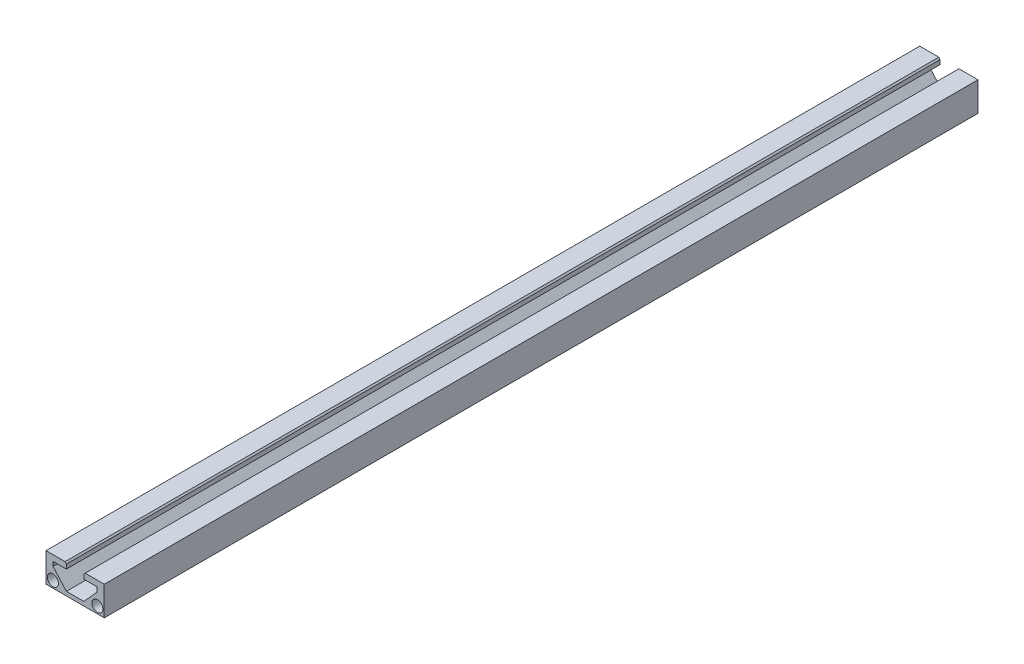
ISO-10303-21;
HEADER;
FILE_DESCRIPTION(('STEP AP214'),'2;1');
FILE_NAME('part.step','',(''),(''),'','','');
FILE_SCHEMA(('AUTOMOTIVE_DESIGN { 1 0 10303 214 1 1 1 1 }'));
ENDSEC;
DATA;
#1=APPLICATION_CONTEXT('core data for automotive mechanical design processes');
#2=APPLICATION_PROTOCOL_DEFINITION('international standard','automotive_design',2000,#1);
#3=PRODUCT_CONTEXT('',#1,'mechanical');
#4=PRODUCT('Part','Part','',(#3));
#5=PRODUCT_RELATED_PRODUCT_CATEGORY('part','',(#4));
#6=PRODUCT_DEFINITION_FORMATION('','',#4);
#7=PRODUCT_DEFINITION_CONTEXT('part definition',#1,'design');
#8=PRODUCT_DEFINITION('design','',#6,#7);
#9=PRODUCT_DEFINITION_SHAPE('','',#8);
#10=(LENGTH_UNIT() NAMED_UNIT(*) SI_UNIT(.MILLI.,.METRE.));
#11=(NAMED_UNIT(*) PLANE_ANGLE_UNIT() SI_UNIT($,.RADIAN.));
#12=(NAMED_UNIT(*) SI_UNIT($,.STERADIAN.) SOLID_ANGLE_UNIT());
#13=UNCERTAINTY_MEASURE_WITH_UNIT(LENGTH_MEASURE(1.E-05),#10,'distance_accuracy_value','');
#14=(GEOMETRIC_REPRESENTATION_CONTEXT(3) GLOBAL_UNCERTAINTY_ASSIGNED_CONTEXT((#13)) GLOBAL_UNIT_ASSIGNED_CONTEXT((#10,
#11,#12)) REPRESENTATION_CONTEXT('',''));
#15=CARTESIAN_POINT('',(0.,0.,0.));
#16=DIRECTION('',(0.,0.,1.));
#17=DIRECTION('',(1.,0.,0.));
#18=AXIS2_PLACEMENT_3D('',#15,#16,#17);
#19=CARTESIAN_POINT('',(3.,0.,150.));
#20=DIRECTION('',(0.,-1.,0.));
#21=DIRECTION('',(1.,0.,0.));
#22=AXIS2_PLACEMENT_3D('',#19,#20,#21);
#23=PLANE('',#22);
#24=CARTESIAN_POINT('',(0.,0.,-140.));
#25=DIRECTION('',(0.,-1.,0.));
#26=DIRECTION('',(-1.,0.,0.));
#27=AXIS2_PLACEMENT_3D('',#24,#25,#26);
#28=CIRCLE('',#27,2.);
#29=CARTESIAN_POINT('',(-2.,0.,-140.));
#30=VERTEX_POINT('',#29);
#31=EDGE_CURVE('E208',#30,#30,#28,.T.);
#32=ORIENTED_EDGE('',*,*,#31,.T.);
#33=EDGE_LOOP('',(#32));
#34=FACE_BOUND('',#33,.T.);
#35=CARTESIAN_POINT('',(0.,0.,140.));
#36=DIRECTION('',(0.,1.,0.));
#37=DIRECTION('',(-1.,0.,0.));
#38=AXIS2_PLACEMENT_3D('',#35,#36,#37);
#39=CIRCLE('',#38,2.);
#40=CARTESIAN_POINT('',(-2.,0.,140.));
#41=VERTEX_POINT('',#40);
#42=EDGE_CURVE('E194',#41,#41,#39,.T.);
#43=ORIENTED_EDGE('',*,*,#42,.F.);
#44=EDGE_LOOP('',(#43));
#45=FACE_BOUND('',#44,.T.);
#46=DIRECTION('',(-1.,0.,0.));
#47=VECTOR('',#46,1.);
#48=CARTESIAN_POINT('',(3.,0.,-150.));
#49=LINE('',#48,#47);
#50=CARTESIAN_POINT('',(3.,0.,-150.));
#51=VERTEX_POINT('',#50);
#52=CARTESIAN_POINT('',(-3.,0.,-150.));
#53=VERTEX_POINT('',#52);
#54=EDGE_CURVE('E147',#51,#53,#49,.T.);
#55=ORIENTED_EDGE('',*,*,#54,.T.);
#56=DIRECTION('',(0.,0.,-1.));
#57=VECTOR('',#56,1.);
#58=CARTESIAN_POINT('',(-3.,0.,150.));
#59=LINE('',#58,#57);
#60=CARTESIAN_POINT('',(-3.,0.,150.));
#61=VERTEX_POINT('',#60);
#62=EDGE_CURVE('E152',#61,#53,#59,.T.);
#63=ORIENTED_EDGE('',*,*,#62,.F.);
#64=DIRECTION('',(-1.,0.,0.));
#65=VECTOR('',#64,1.);
#66=CARTESIAN_POINT('',(3.,0.,150.));
#67=LINE('',#66,#65);
#68=CARTESIAN_POINT('',(3.,0.,150.));
#69=VERTEX_POINT('',#68);
#70=EDGE_CURVE('E173',#69,#61,#67,.T.);
#71=ORIENTED_EDGE('',*,*,#70,.F.);
#72=DIRECTION('',(0.,0.,-1.));
#73=VECTOR('',#72,1.);
#74=CARTESIAN_POINT('',(3.,0.,150.));
#75=LINE('',#74,#73);
#76=EDGE_CURVE('E143',#69,#51,#75,.T.);
#77=ORIENTED_EDGE('',*,*,#76,.T.);
#78=EDGE_LOOP('',(#55,#63,#71,#77));
#79=FACE_BOUND('',#78,.T.);
#80=ADVANCED_FACE('F39',(#34,#45,#79),#23,.F.);
#81=CARTESIAN_POINT('',(0.,-1.38297872340426,150.));
#82=DIRECTION('',(0.,1.,0.));
#83=DIRECTION('',(0.,0.,1.));
#84=AXIS2_PLACEMENT_3D('',#81,#82,#83);
#85=PLANE('',#84);
#86=CARTESIAN_POINT('',(0.,-1.38297872340426,-140.));
#87=DIRECTION('',(0.,1.,0.));
#88=DIRECTION('',(0.,0.,1.));
#89=AXIS2_PLACEMENT_3D('',#86,#87,#88);
#90=CIRCLE('',#89,2.);
#91=CARTESIAN_POINT('',(0.,-1.38297872340426,-138.));
#92=VERTEX_POINT('',#91);
#93=EDGE_CURVE('E42',#92,#92,#90,.F.);
#94=ORIENTED_EDGE('',*,*,#93,.F.);
#95=EDGE_LOOP('',(#94));
#96=FACE_BOUND('',#95,.T.);
#97=CARTESIAN_POINT('',(0.,-1.38297872340426,140.));
#98=DIRECTION('',(0.,1.,0.));
#99=DIRECTION('',(0.,0.,1.));
#100=AXIS2_PLACEMENT_3D('',#97,#98,#99);
#101=CIRCLE('',#100,2.);
#102=CARTESIAN_POINT('',(0.,-1.38297872340426,142.));
#103=VERTEX_POINT('',#102);
#104=EDGE_CURVE('E190',#103,#103,#101,.T.);
#105=ORIENTED_EDGE('',*,*,#104,.T.);
#106=EDGE_LOOP('',(#105));
#107=FACE_BOUND('',#106,.T.);
#108=DIRECTION('',(1.,0.,0.));
#109=VECTOR('',#108,1.);
#110=CARTESIAN_POINT('',(0.,-1.38297872340426,-150.));
#111=LINE('',#110,#109);
#112=CARTESIAN_POINT('',(-10.,-1.38297872340426,-150.));
#113=VERTEX_POINT('',#112);
#114=CARTESIAN_POINT('',(10.,-1.38297872340426,-150.));
#115=VERTEX_POINT('',#114);
#116=EDGE_CURVE('E151',#113,#115,#111,.T.);
#117=ORIENTED_EDGE('',*,*,#116,.T.);
#118=DIRECTION('',(0.,0.,-1.));
#119=VECTOR('',#118,1.);
#120=CARTESIAN_POINT('',(10.,-1.38297872340426,150.));
#121=LINE('',#120,#119);
#122=CARTESIAN_POINT('',(10.,-1.38297872340426,150.));
#123=VERTEX_POINT('',#122);
#124=EDGE_CURVE('E11',#123,#115,#121,.T.);
#125=ORIENTED_EDGE('',*,*,#124,.F.);
#126=DIRECTION('',(1.,0.,0.));
#127=VECTOR('',#126,1.);
#128=CARTESIAN_POINT('',(0.,-1.38297872340426,150.));
#129=LINE('',#128,#127);
#130=CARTESIAN_POINT('',(-10.,-1.38297872340426,150.));
#131=VERTEX_POINT('',#130);
#132=EDGE_CURVE('E102',#131,#123,#129,.T.);
#133=ORIENTED_EDGE('',*,*,#132,.F.);
#134=DIRECTION('',(0.,0.,-1.));
#135=VECTOR('',#134,1.);
#136=CARTESIAN_POINT('',(-10.,-1.38297872340426,150.));
#137=LINE('',#136,#135);
#138=EDGE_CURVE('E252',#131,#113,#137,.T.);
#139=ORIENTED_EDGE('',*,*,#138,.T.);
#140=EDGE_LOOP('',(#117,#125,#133,#139));
#141=FACE_BOUND('',#140,.T.);
#142=ADVANCED_FACE('F382',(#96,#107,#141),#85,.F.);
#143=CARTESIAN_POINT('',(10.,-1.38297872340426,150.));
#144=DIRECTION('',(-1.,0.,0.));
#145=DIRECTION('',(0.,0.,1.));
#146=AXIS2_PLACEMENT_3D('',#143,#144,#145);
#147=PLANE('',#146);
#148=DIRECTION('',(0.,1.,0.));
#149=VECTOR('',#148,1.);
#150=CARTESIAN_POINT('',(10.,-1.38297872340426,-150.));
#151=LINE('',#150,#149);
#152=CARTESIAN_POINT('',(10.,8.61702127659574,-150.));
#153=VERTEX_POINT('',#152);
#154=EDGE_CURVE('E155',#115,#153,#151,.T.);
#155=ORIENTED_EDGE('',*,*,#154,.T.);
#156=DIRECTION('',(0.,0.,-1.));
#157=VECTOR('',#156,1.);
#158=CARTESIAN_POINT('',(10.,8.61702127659574,150.));
#159=LINE('',#158,#157);
#160=CARTESIAN_POINT('',(10.,8.61702127659574,150.));
#161=VERTEX_POINT('',#160);
#162=EDGE_CURVE('E49',#161,#153,#159,.T.);
#163=ORIENTED_EDGE('',*,*,#162,.F.);
#164=DIRECTION('',(0.,1.,0.));
#165=VECTOR('',#164,1.);
#166=CARTESIAN_POINT('',(10.,-1.38297872340426,150.));
#167=LINE('',#166,#165);
#168=EDGE_CURVE('E313',#123,#161,#167,.T.);
#169=ORIENTED_EDGE('',*,*,#168,.F.);
#170=ORIENTED_EDGE('',*,*,#124,.T.);
#171=EDGE_LOOP('',(#155,#163,#169,#170));
#172=FACE_BOUND('',#171,.T.);
#173=ADVANCED_FACE('F403',(#172),#147,.F.);
#174=CARTESIAN_POINT('',(10.,8.61702127659574,150.));
#175=DIRECTION('',(0.,-1.,0.));
#176=DIRECTION('',(1.,0.,0.));
#177=AXIS2_PLACEMENT_3D('',#174,#175,#176);
#178=PLANE('',#177);
#179=DIRECTION('',(-1.,0.,0.));
#180=VECTOR('',#179,1.);
#181=CARTESIAN_POINT('',(10.,8.61702127659574,-150.));
#182=LINE('',#181,#180);
#183=CARTESIAN_POINT('',(3.44821174677154,8.61702127659574,-150.));
#184=VERTEX_POINT('',#183);
#185=EDGE_CURVE('E158',#153,#184,#182,.T.);
#186=ORIENTED_EDGE('',*,*,#185,.T.);
#187=DIRECTION('',(0.,0.,-1.));
#188=VECTOR('',#187,1.);
#189=CARTESIAN_POINT('',(3.44821174677154,8.61702127659574,150.));
#190=LINE('',#189,#188);
#191=CARTESIAN_POINT('',(3.44821174677154,8.61702127659574,150.));
#192=VERTEX_POINT('',#191);
#193=EDGE_CURVE('E184',#192,#184,#190,.T.);
#194=ORIENTED_EDGE('',*,*,#193,.F.);
#195=DIRECTION('',(-1.,0.,0.));
#196=VECTOR('',#195,1.);
#197=CARTESIAN_POINT('',(10.,8.61702127659574,150.));
#198=LINE('',#197,#196);
#199=EDGE_CURVE('E316',#161,#192,#198,.T.);
#200=ORIENTED_EDGE('',*,*,#199,.F.);
#201=ORIENTED_EDGE('',*,*,#162,.T.);
#202=EDGE_LOOP('',(#186,#194,#200,#201));
#203=FACE_BOUND('',#202,.T.);
#204=ADVANCED_FACE('F453',(#203),#178,.F.);
#205=CARTESIAN_POINT('',(3.44821174677154,8.61702127659574,150.));
#206=DIRECTION('',(0.744616896860696,-0.667492080035073,0.));
#207=DIRECTION('',(0.667492080035073,0.744616896860696,0.));
#208=AXIS2_PLACEMENT_3D('',#205,#206,#207);
#209=PLANE('',#208);
#210=DIRECTION('',(-0.667492080035073,-0.744616896860696,0.));
#211=VECTOR('',#210,1.);
#212=CARTESIAN_POINT('',(3.44821174677154,8.61702127659574,-150.));
#213=LINE('',#212,#211);
#214=CARTESIAN_POINT('',(3.,8.11702127659574,-150.));
#215=VERTEX_POINT('',#214);
#216=EDGE_CURVE('E161',#184,#215,#213,.T.);
#217=ORIENTED_EDGE('',*,*,#216,.T.);
#218=DIRECTION('',(0.,0.,-1.));
#219=VECTOR('',#218,1.);
#220=CARTESIAN_POINT('',(3.,8.11702127659574,150.));
#221=LINE('',#220,#219);
#222=CARTESIAN_POINT('',(3.,8.11702127659574,150.));
#223=VERTEX_POINT('',#222);
#224=EDGE_CURVE('E180',#223,#215,#221,.T.);
#225=ORIENTED_EDGE('',*,*,#224,.F.);
#226=DIRECTION('',(-0.667492080035073,-0.744616896860696,0.));
#227=VECTOR('',#226,1.);
#228=CARTESIAN_POINT('',(3.44821174677154,8.61702127659574,150.));
#229=LINE('',#228,#227);
#230=EDGE_CURVE('E319',#192,#223,#229,.T.);
#231=ORIENTED_EDGE('',*,*,#230,.F.);
#232=ORIENTED_EDGE('',*,*,#193,.T.);
#233=EDGE_LOOP('',(#217,#225,#231,#232));
#234=FACE_BOUND('',#233,.T.);
#235=ADVANCED_FACE('F327',(#234),#209,.F.);
#236=CARTESIAN_POINT('',(3.,8.11702127659574,150.));
#237=DIRECTION('',(1.,0.,0.));
#238=DIRECTION('',(0.,0.,-1.));
#239=AXIS2_PLACEMENT_3D('',#236,#237,#238);
#240=PLANE('',#239);
#241=DIRECTION('',(0.,-1.,0.));
#242=VECTOR('',#241,1.);
#243=CARTESIAN_POINT('',(3.,8.11702127659574,-150.));
#244=LINE('',#243,#242);
#245=CARTESIAN_POINT('',(3.,6.61702127659574,-150.));
#246=VERTEX_POINT('',#245);
#247=EDGE_CURVE('E164',#215,#246,#244,.T.);
#248=ORIENTED_EDGE('',*,*,#247,.T.);
#249=DIRECTION('',(0.,0.,-1.));
#250=VECTOR('',#249,1.);
#251=CARTESIAN_POINT('',(3.,6.61702127659574,150.));
#252=LINE('',#251,#250);
#253=CARTESIAN_POINT('',(3.,6.61702127659574,150.));
#254=VERTEX_POINT('',#253);
#255=EDGE_CURVE('E136',#254,#246,#252,.T.);
#256=ORIENTED_EDGE('',*,*,#255,.F.);
#257=DIRECTION('',(0.,-1.,0.));
#258=VECTOR('',#257,1.);
#259=CARTESIAN_POINT('',(3.,8.11702127659574,150.));
#260=LINE('',#259,#258);
#261=EDGE_CURVE('E125',#223,#254,#260,.T.);
#262=ORIENTED_EDGE('',*,*,#261,.F.);
#263=ORIENTED_EDGE('',*,*,#224,.T.);
#264=EDGE_LOOP('',(#248,#256,#262,#263));
#265=FACE_BOUND('',#264,.T.);
#266=ADVANCED_FACE('F331',(#265),#240,.F.);
#267=CARTESIAN_POINT('',(3.,6.61702127659574,150.));
#268=DIRECTION('',(0.,1.,0.));
#269=DIRECTION('',(0.,0.,1.));
#270=AXIS2_PLACEMENT_3D('',#267,#268,#269);
#271=PLANE('',#270);
#272=DIRECTION('',(1.,0.,0.));
#273=VECTOR('',#272,1.);
#274=CARTESIAN_POINT('',(3.,6.61702127659574,-150.));
#275=LINE('',#274,#273);
#276=CARTESIAN_POINT('',(7.58701808930022,6.61702127659574,-150.));
#277=VERTEX_POINT('',#276);
#278=EDGE_CURVE('E134',#246,#277,#275,.T.);
#279=ORIENTED_EDGE('',*,*,#278,.T.);
#280=DIRECTION('',(0.,0.,-1.));
#281=VECTOR('',#280,1.);
#282=CARTESIAN_POINT('',(7.58701808930022,6.61702127659574,150.));
#283=LINE('',#282,#281);
#284=CARTESIAN_POINT('',(7.58701808930022,6.61702127659574,150.));
#285=VERTEX_POINT('',#284);
#286=EDGE_CURVE('E131',#285,#277,#283,.T.);
#287=ORIENTED_EDGE('',*,*,#286,.F.);
#288=DIRECTION('',(1.,0.,0.));
#289=VECTOR('',#288,1.);
#290=CARTESIAN_POINT('',(3.,6.61702127659574,150.));
#291=LINE('',#290,#289);
#292=EDGE_CURVE('E119',#254,#285,#291,.T.);
#293=ORIENTED_EDGE('',*,*,#292,.F.);
#294=ORIENTED_EDGE('',*,*,#255,.T.);
#295=EDGE_LOOP('',(#279,#287,#293,#294));
#296=FACE_BOUND('',#295,.T.);
#297=ADVANCED_FACE('F132',(#296),#271,.F.);
#298=CARTESIAN_POINT('',(7.58701808930022,6.61702127659574,150.));
#299=DIRECTION('',(1.,0.,0.));
#300=DIRECTION('',(0.,1.,0.));
#301=AXIS2_PLACEMENT_3D('',#298,#299,#300);
#302=PLANE('',#301);
#303=DIRECTION('',(0.,-1.,0.));
#304=VECTOR('',#303,1.);
#305=CARTESIAN_POINT('',(7.58701808930022,6.61702127659574,-150.));
#306=LINE('',#305,#304);
#307=CARTESIAN_POINT('',(7.58701808930022,5.11702127659574,-150.));
#308=VERTEX_POINT('',#307);
#309=EDGE_CURVE('E88',#277,#308,#306,.T.);
#310=ORIENTED_EDGE('',*,*,#309,.T.);
#311=DIRECTION('',(0.,0.,-1.));
#312=VECTOR('',#311,1.);
#313=CARTESIAN_POINT('',(7.58701808930022,5.11702127659574,150.));
#314=LINE('',#313,#312);
#315=CARTESIAN_POINT('',(7.58701808930022,5.11702127659574,150.));
#316=VERTEX_POINT('',#315);
#317=EDGE_CURVE('E137',#316,#308,#314,.T.);
#318=ORIENTED_EDGE('',*,*,#317,.F.);
#319=DIRECTION('',(0.,-1.,0.));
#320=VECTOR('',#319,1.);
#321=CARTESIAN_POINT('',(7.58701808930022,6.61702127659574,150.));
#322=LINE('',#321,#320);
#323=EDGE_CURVE('E123',#285,#316,#322,.T.);
#324=ORIENTED_EDGE('',*,*,#323,.F.);
#325=ORIENTED_EDGE('',*,*,#286,.T.);
#326=EDGE_LOOP('',(#310,#318,#324,#325));
#327=FACE_BOUND('',#326,.T.);
#328=ADVANCED_FACE('F139',(#327),#302,.F.);
#329=CARTESIAN_POINT('',(7.58701808930022,5.11702127659574,150.));
#330=DIRECTION('',(0.744616896860696,-0.667492080035072,0.));
#331=DIRECTION('',(0.667492080035072,0.744616896860696,0.));
#332=AXIS2_PLACEMENT_3D('',#329,#330,#331);
#333=PLANE('',#332);
#334=DIRECTION('',(-0.667492080035072,-0.744616896860696,0.));
#335=VECTOR('',#334,1.);
#336=CARTESIAN_POINT('',(7.58701808930022,5.11702127659574,-150.));
#337=LINE('',#336,#335);
#338=EDGE_CURVE('E94',#308,#51,#337,.T.);
#339=ORIENTED_EDGE('',*,*,#338,.T.);
#340=ORIENTED_EDGE('',*,*,#76,.F.);
#341=DIRECTION('',(-0.667492080035072,-0.744616896860696,0.));
#342=VECTOR('',#341,1.);
#343=CARTESIAN_POINT('',(7.58701808930022,5.11702127659574,150.));
#344=LINE('',#343,#342);
#345=EDGE_CURVE('E58',#316,#69,#344,.T.);
#346=ORIENTED_EDGE('',*,*,#345,.F.);
#347=ORIENTED_EDGE('',*,*,#317,.T.);
#348=EDGE_LOOP('',(#339,#340,#346,#347));
#349=FACE_BOUND('',#348,.T.);
#350=ADVANCED_FACE('F431',(#349),#333,.F.);
#351=CARTESIAN_POINT('',(0.,0.,150.));
#352=DIRECTION('',(0.,0.,1.));
#353=DIRECTION('',(1.,0.,0.));
#354=AXIS2_PLACEMENT_3D('',#351,#352,#353);
#355=PLANE('',#354);
#356=CARTESIAN_POINT('',(-7.64671625703689,0.970305019558831,150.));
#357=DIRECTION('',(0.,0.,-1.));
#358=DIRECTION('',(-1.,0.,0.));
#359=AXIS2_PLACEMENT_3D('',#356,#357,#358);
#360=CIRCLE('',#359,1.9);
#361=CARTESIAN_POINT('',(-9.54671625703689,0.970305019558831,150.));
#362=VERTEX_POINT('',#361);
#363=EDGE_CURVE('E193',#362,#362,#360,.T.);
#364=ORIENTED_EDGE('',*,*,#363,.T.);
#365=EDGE_LOOP('',(#364));
#366=FACE_BOUND('',#365,.T.);
#367=CARTESIAN_POINT('',(7.64671625703689,0.970305019558831,150.));
#368=DIRECTION('',(0.,0.,1.));
#369=DIRECTION('',(1.,0.,0.));
#370=AXIS2_PLACEMENT_3D('',#367,#368,#369);
#371=CIRCLE('',#370,1.9);
#372=CARTESIAN_POINT('',(9.54671625703689,0.970305019558831,150.));
#373=VERTEX_POINT('',#372);
#374=EDGE_CURVE('E213',#373,#373,#371,.T.);
#375=ORIENTED_EDGE('',*,*,#374,.F.);
#376=EDGE_LOOP('',(#375));
#377=FACE_BOUND('',#376,.T.);
#378=ORIENTED_EDGE('',*,*,#70,.T.);
#379=DIRECTION('',(0.667492080035072,-0.744616896860696,0.));
#380=VECTOR('',#379,1.);
#381=CARTESIAN_POINT('',(-7.58701808930022,5.11702127659574,150.));
#382=LINE('',#381,#380);
#383=CARTESIAN_POINT('',(-7.58701808930022,5.11702127659574,150.));
#384=VERTEX_POINT('',#383);
#385=EDGE_CURVE('E223',#384,#61,#382,.T.);
#386=ORIENTED_EDGE('',*,*,#385,.F.);
#387=DIRECTION('',(0.,-1.,0.));
#388=VECTOR('',#387,1.);
#389=CARTESIAN_POINT('',(-7.58701808930022,6.61702127659574,150.));
#390=LINE('',#389,#388);
#391=CARTESIAN_POINT('',(-7.58701808930022,6.61702127659574,150.));
#392=VERTEX_POINT('',#391);
#393=EDGE_CURVE('E227',#392,#384,#390,.T.);
#394=ORIENTED_EDGE('',*,*,#393,.F.);
#395=DIRECTION('',(-1.,0.,0.));
#396=VECTOR('',#395,1.);
#397=CARTESIAN_POINT('',(-3.,6.61702127659574,150.));
#398=LINE('',#397,#396);
#399=CARTESIAN_POINT('',(-3.,6.61702127659574,150.));
#400=VERTEX_POINT('',#399);
#401=EDGE_CURVE('E232',#400,#392,#398,.T.);
#402=ORIENTED_EDGE('',*,*,#401,.F.);
#403=DIRECTION('',(0.,-1.,0.));
#404=VECTOR('',#403,1.);
#405=CARTESIAN_POINT('',(-3.,8.11702127659574,150.));
#406=LINE('',#405,#404);
#407=CARTESIAN_POINT('',(-3.,8.11702127659574,150.));
#408=VERTEX_POINT('',#407);
#409=EDGE_CURVE('E236',#408,#400,#406,.T.);
#410=ORIENTED_EDGE('',*,*,#409,.F.);
#411=DIRECTION('',(0.667492080035073,-0.744616896860696,0.));
#412=VECTOR('',#411,1.);
#413=CARTESIAN_POINT('',(-3.44821174677154,8.61702127659574,150.));
#414=LINE('',#413,#412);
#415=CARTESIAN_POINT('',(-3.44821174677154,8.61702127659574,150.));
#416=VERTEX_POINT('',#415);
#417=EDGE_CURVE('E240',#416,#408,#414,.T.);
#418=ORIENTED_EDGE('',*,*,#417,.F.);
#419=DIRECTION('',(1.,0.,0.));
#420=VECTOR('',#419,1.);
#421=CARTESIAN_POINT('',(-10.,8.61702127659574,150.));
#422=LINE('',#421,#420);
#423=CARTESIAN_POINT('',(-10.,8.61702127659574,150.));
#424=VERTEX_POINT('',#423);
#425=EDGE_CURVE('E244',#424,#416,#422,.T.);
#426=ORIENTED_EDGE('',*,*,#425,.F.);
#427=DIRECTION('',(0.,1.,0.));
#428=VECTOR('',#427,1.);
#429=CARTESIAN_POINT('',(-10.,-1.38297872340426,150.));
#430=LINE('',#429,#428);
#431=EDGE_CURVE('E248',#131,#424,#430,.T.);
#432=ORIENTED_EDGE('',*,*,#431,.F.);
#433=ORIENTED_EDGE('',*,*,#132,.T.);
#434=ORIENTED_EDGE('',*,*,#168,.T.);
#435=ORIENTED_EDGE('',*,*,#199,.T.);
#436=ORIENTED_EDGE('',*,*,#230,.T.);
#437=ORIENTED_EDGE('',*,*,#261,.T.);
#438=ORIENTED_EDGE('',*,*,#292,.T.);
#439=ORIENTED_EDGE('',*,*,#323,.T.);
#440=ORIENTED_EDGE('',*,*,#345,.T.);
#441=EDGE_LOOP('',(#378,#386,#394,#402,#410,#418,#426,#432,#433,#434,#435,#436,#437,#438,#439,#440));
#442=FACE_BOUND('',#441,.T.);
#443=ADVANCED_FACE('F121',(#366,#377,#442),#355,.T.);
#444=CARTESIAN_POINT('',(0.,0.,-150.));
#445=DIRECTION('',(0.,0.,1.));
#446=DIRECTION('',(1.,0.,0.));
#447=AXIS2_PLACEMENT_3D('',#444,#445,#446);
#448=PLANE('',#447);
#449=CARTESIAN_POINT('',(-7.64671625703689,0.970305019558831,-150.));
#450=DIRECTION('',(0.,0.,-1.));
#451=DIRECTION('',(-1.,0.,0.));
#452=AXIS2_PLACEMENT_3D('',#449,#450,#451);
#453=CIRCLE('',#452,1.9);
#454=CARTESIAN_POINT('',(-9.54671625703689,0.970305019558831,-150.));
#455=VERTEX_POINT('',#454);
#456=EDGE_CURVE('E200',#455,#455,#453,.T.);
#457=ORIENTED_EDGE('',*,*,#456,.F.);
#458=EDGE_LOOP('',(#457));
#459=FACE_BOUND('',#458,.T.);
#460=CARTESIAN_POINT('',(7.64671625703689,0.970305019558831,-150.));
#461=DIRECTION('',(0.,0.,1.));
#462=DIRECTION('',(1.,0.,0.));
#463=AXIS2_PLACEMENT_3D('',#460,#461,#462);
#464=CIRCLE('',#463,1.9);
#465=CARTESIAN_POINT('',(9.54671625703689,0.970305019558831,-150.));
#466=VERTEX_POINT('',#465);
#467=EDGE_CURVE('E215',#466,#466,#464,.T.);
#468=ORIENTED_EDGE('',*,*,#467,.T.);
#469=EDGE_LOOP('',(#468));
#470=FACE_BOUND('',#469,.T.);
#471=ORIENTED_EDGE('',*,*,#54,.F.);
#472=ORIENTED_EDGE('',*,*,#338,.F.);
#473=ORIENTED_EDGE('',*,*,#309,.F.);
#474=ORIENTED_EDGE('',*,*,#278,.F.);
#475=ORIENTED_EDGE('',*,*,#247,.F.);
#476=ORIENTED_EDGE('',*,*,#216,.F.);
#477=ORIENTED_EDGE('',*,*,#185,.F.);
#478=ORIENTED_EDGE('',*,*,#154,.F.);
#479=ORIENTED_EDGE('',*,*,#116,.F.);
#480=DIRECTION('',(0.,1.,0.));
#481=VECTOR('',#480,1.);
#482=CARTESIAN_POINT('',(-10.,-1.38297872340426,-150.));
#483=LINE('',#482,#481);
#484=CARTESIAN_POINT('',(-10.,8.61702127659574,-150.));
#485=VERTEX_POINT('',#484);
#486=EDGE_CURVE('E228',#113,#485,#483,.T.);
#487=ORIENTED_EDGE('',*,*,#486,.T.);
#488=DIRECTION('',(1.,0.,0.));
#489=VECTOR('',#488,1.);
#490=CARTESIAN_POINT('',(-10.,8.61702127659574,-150.));
#491=LINE('',#490,#489);
#492=CARTESIAN_POINT('',(-3.44821174677154,8.61702127659574,-150.));
#493=VERTEX_POINT('',#492);
#494=EDGE_CURVE('E272',#485,#493,#491,.T.);
#495=ORIENTED_EDGE('',*,*,#494,.T.);
#496=DIRECTION('',(0.667492080035073,-0.744616896860696,0.));
#497=VECTOR('',#496,1.);
#498=CARTESIAN_POINT('',(-3.44821174677154,8.61702127659574,-150.));
#499=LINE('',#498,#497);
#500=CARTESIAN_POINT('',(-3.,8.11702127659574,-150.));
#501=VERTEX_POINT('',#500);
#502=EDGE_CURVE('E268',#493,#501,#499,.T.);
#503=ORIENTED_EDGE('',*,*,#502,.T.);
#504=DIRECTION('',(0.,-1.,0.));
#505=VECTOR('',#504,1.);
#506=CARTESIAN_POINT('',(-3.,8.11702127659574,-150.));
#507=LINE('',#506,#505);
#508=CARTESIAN_POINT('',(-3.,6.61702127659574,-150.));
#509=VERTEX_POINT('',#508);
#510=EDGE_CURVE('E264',#501,#509,#507,.T.);
#511=ORIENTED_EDGE('',*,*,#510,.T.);
#512=DIRECTION('',(-1.,0.,0.));
#513=VECTOR('',#512,1.);
#514=CARTESIAN_POINT('',(-3.,6.61702127659574,-150.));
#515=LINE('',#514,#513);
#516=CARTESIAN_POINT('',(-7.58701808930022,6.61702127659574,-150.));
#517=VERTEX_POINT('',#516);
#518=EDGE_CURVE('E260',#509,#517,#515,.T.);
#519=ORIENTED_EDGE('',*,*,#518,.T.);
#520=DIRECTION('',(0.,-1.,0.));
#521=VECTOR('',#520,1.);
#522=CARTESIAN_POINT('',(-7.58701808930022,6.61702127659574,-150.));
#523=LINE('',#522,#521);
#524=CARTESIAN_POINT('',(-7.58701808930022,5.11702127659574,-150.));
#525=VERTEX_POINT('',#524);
#526=EDGE_CURVE('E256',#517,#525,#523,.T.);
#527=ORIENTED_EDGE('',*,*,#526,.T.);
#528=DIRECTION('',(0.667492080035072,-0.744616896860696,0.));
#529=VECTOR('',#528,1.);
#530=CARTESIAN_POINT('',(-7.58701808930022,5.11702127659574,-150.));
#531=LINE('',#530,#529);
#532=EDGE_CURVE('E219',#525,#53,#531,.T.);
#533=ORIENTED_EDGE('',*,*,#532,.T.);
#534=EDGE_LOOP('',(#471,#472,#473,#474,#475,#476,#477,#478,#479,#487,#495,#503,#511,#519,#527,#533));
#535=FACE_BOUND('',#534,.T.);
#536=ADVANCED_FACE('F334',(#459,#470,#535),#448,.F.);
#537=CARTESIAN_POINT('',(-7.58701808930022,5.11702127659574,150.));
#538=DIRECTION('',(0.744616896860696,0.667492080035072,0.));
#539=DIRECTION('',(-0.667492080035072,0.744616896860696,0.));
#540=AXIS2_PLACEMENT_3D('',#537,#538,#539);
#541=PLANE('',#540);
#542=ORIENTED_EDGE('',*,*,#532,.F.);
#543=DIRECTION('',(0.,0.,-1.));
#544=VECTOR('',#543,1.);
#545=CARTESIAN_POINT('',(-7.58701808930022,5.11702127659574,150.));
#546=LINE('',#545,#544);
#547=EDGE_CURVE('E302',#384,#525,#546,.T.);
#548=ORIENTED_EDGE('',*,*,#547,.F.);
#549=ORIENTED_EDGE('',*,*,#385,.T.);
#550=ORIENTED_EDGE('',*,*,#62,.T.);
#551=EDGE_LOOP('',(#542,#548,#549,#550));
#552=FACE_BOUND('',#551,.T.);
#553=ADVANCED_FACE('F344',(#552),#541,.T.);
#554=CARTESIAN_POINT('',(-7.58701808930022,6.61702127659574,150.));
#555=DIRECTION('',(1.,0.,0.));
#556=DIRECTION('',(0.,1.,0.));
#557=AXIS2_PLACEMENT_3D('',#554,#555,#556);
#558=PLANE('',#557);
#559=ORIENTED_EDGE('',*,*,#526,.F.);
#560=DIRECTION('',(0.,0.,-1.));
#561=VECTOR('',#560,1.);
#562=CARTESIAN_POINT('',(-7.58701808930022,6.61702127659574,150.));
#563=LINE('',#562,#561);
#564=EDGE_CURVE('E298',#392,#517,#563,.T.);
#565=ORIENTED_EDGE('',*,*,#564,.F.);
#566=ORIENTED_EDGE('',*,*,#393,.T.);
#567=ORIENTED_EDGE('',*,*,#547,.T.);
#568=EDGE_LOOP('',(#559,#565,#566,#567));
#569=FACE_BOUND('',#568,.T.);
#570=ADVANCED_FACE('F356',(#569),#558,.T.);
#571=CARTESIAN_POINT('',(-3.,6.61702127659574,150.));
#572=DIRECTION('',(0.,-1.,0.));
#573=DIRECTION('',(0.,0.,-1.));
#574=AXIS2_PLACEMENT_3D('',#571,#572,#573);
#575=PLANE('',#574);
#576=ORIENTED_EDGE('',*,*,#518,.F.);
#577=DIRECTION('',(0.,0.,-1.));
#578=VECTOR('',#577,1.);
#579=CARTESIAN_POINT('',(-3.,6.61702127659574,150.));
#580=LINE('',#579,#578);
#581=EDGE_CURVE('E294',#400,#509,#580,.T.);
#582=ORIENTED_EDGE('',*,*,#581,.F.);
#583=ORIENTED_EDGE('',*,*,#401,.T.);
#584=ORIENTED_EDGE('',*,*,#564,.T.);
#585=EDGE_LOOP('',(#576,#582,#583,#584));
#586=FACE_BOUND('',#585,.T.);
#587=ADVANCED_FACE('F362',(#586),#575,.T.);
#588=CARTESIAN_POINT('',(-3.,8.11702127659574,150.));
#589=DIRECTION('',(1.,0.,0.));
#590=DIRECTION('',(0.,0.,-1.));
#591=AXIS2_PLACEMENT_3D('',#588,#589,#590);
#592=PLANE('',#591);
#593=ORIENTED_EDGE('',*,*,#510,.F.);
#594=DIRECTION('',(0.,0.,-1.));
#595=VECTOR('',#594,1.);
#596=CARTESIAN_POINT('',(-3.,8.11702127659574,150.));
#597=LINE('',#596,#595);
#598=EDGE_CURVE('E290',#408,#501,#597,.T.);
#599=ORIENTED_EDGE('',*,*,#598,.F.);
#600=ORIENTED_EDGE('',*,*,#409,.T.);
#601=ORIENTED_EDGE('',*,*,#581,.T.);
#602=EDGE_LOOP('',(#593,#599,#600,#601));
#603=FACE_BOUND('',#602,.T.);
#604=ADVANCED_FACE('F514',(#603),#592,.T.);
#605=CARTESIAN_POINT('',(-3.44821174677154,8.61702127659574,150.));
#606=DIRECTION('',(0.744616896860696,0.667492080035073,0.));
#607=DIRECTION('',(-0.667492080035073,0.744616896860696,0.));
#608=AXIS2_PLACEMENT_3D('',#605,#606,#607);
#609=PLANE('',#608);
#610=ORIENTED_EDGE('',*,*,#502,.F.);
#611=DIRECTION('',(0.,0.,-1.));
#612=VECTOR('',#611,1.);
#613=CARTESIAN_POINT('',(-3.44821174677154,8.61702127659574,150.));
#614=LINE('',#613,#612);
#615=EDGE_CURVE('E286',#416,#493,#614,.T.);
#616=ORIENTED_EDGE('',*,*,#615,.F.);
#617=ORIENTED_EDGE('',*,*,#417,.T.);
#618=ORIENTED_EDGE('',*,*,#598,.T.);
#619=EDGE_LOOP('',(#610,#616,#617,#618));
#620=FACE_BOUND('',#619,.T.);
#621=ADVANCED_FACE('F395',(#620),#609,.T.);
#622=CARTESIAN_POINT('',(-10.,8.61702127659574,150.));
#623=DIRECTION('',(0.,1.,0.));
#624=DIRECTION('',(-1.,0.,0.));
#625=AXIS2_PLACEMENT_3D('',#622,#623,#624);
#626=PLANE('',#625);
#627=ORIENTED_EDGE('',*,*,#494,.F.);
#628=DIRECTION('',(0.,0.,-1.));
#629=VECTOR('',#628,1.);
#630=CARTESIAN_POINT('',(-10.,8.61702127659574,150.));
#631=LINE('',#630,#629);
#632=EDGE_CURVE('E282',#424,#485,#631,.T.);
#633=ORIENTED_EDGE('',*,*,#632,.F.);
#634=ORIENTED_EDGE('',*,*,#425,.T.);
#635=ORIENTED_EDGE('',*,*,#615,.T.);
#636=EDGE_LOOP('',(#627,#633,#634,#635));
#637=FACE_BOUND('',#636,.T.);
#638=ADVANCED_FACE('F386',(#637),#626,.T.);
#639=CARTESIAN_POINT('',(-10.,-1.38297872340426,150.));
#640=DIRECTION('',(-1.,0.,0.));
#641=DIRECTION('',(0.,0.,1.));
#642=AXIS2_PLACEMENT_3D('',#639,#640,#641);
#643=PLANE('',#642);
#644=ORIENTED_EDGE('',*,*,#486,.F.);
#645=ORIENTED_EDGE('',*,*,#138,.F.);
#646=ORIENTED_EDGE('',*,*,#431,.T.);
#647=ORIENTED_EDGE('',*,*,#632,.T.);
#648=EDGE_LOOP('',(#644,#645,#646,#647));
#649=FACE_BOUND('',#648,.T.);
#650=ADVANCED_FACE('F383',(#649),#643,.T.);
#651=CARTESIAN_POINT('',(7.64671625703689,0.970305019558831,-150.));
#652=DIRECTION('',(0.,0.,1.));
#653=DIRECTION('',(1.,0.,0.));
#654=AXIS2_PLACEMENT_3D('',#651,#652,#653);
#655=CYLINDRICAL_SURFACE('',#654,1.9);
#656=ORIENTED_EDGE('',*,*,#467,.F.);
#657=EDGE_LOOP('',(#656));
#658=FACE_BOUND('',#657,.T.);
#659=ORIENTED_EDGE('',*,*,#374,.T.);
#660=EDGE_LOOP('',(#659));
#661=FACE_BOUND('',#660,.T.);
#662=ADVANCED_FACE('F385',(#658,#661),#655,.F.);
#663=CARTESIAN_POINT('',(-7.64671625703689,0.970305019558831,-150.));
#664=DIRECTION('',(0.,0.,1.));
#665=DIRECTION('',(1.,0.,0.));
#666=AXIS2_PLACEMENT_3D('',#663,#664,#665);
#667=CYLINDRICAL_SURFACE('',#666,1.9);
#668=ORIENTED_EDGE('',*,*,#456,.T.);
#669=EDGE_LOOP('',(#668));
#670=FACE_BOUND('',#669,.T.);
#671=ORIENTED_EDGE('',*,*,#363,.F.);
#672=EDGE_LOOP('',(#671));
#673=FACE_BOUND('',#672,.T.);
#674=ADVANCED_FACE('F392',(#670,#673),#667,.F.);
#675=CARTESIAN_POINT('',(0.,-10.,140.));
#676=DIRECTION('',(0.,1.,0.));
#677=DIRECTION('',(-1.,0.,0.));
#678=AXIS2_PLACEMENT_3D('',#675,#676,#677);
#679=CYLINDRICAL_SURFACE('',#678,2.);
#680=ORIENTED_EDGE('',*,*,#42,.T.);
#681=EDGE_LOOP('',(#680));
#682=FACE_BOUND('',#681,.T.);
#683=ORIENTED_EDGE('',*,*,#104,.F.);
#684=EDGE_LOOP('',(#683));
#685=FACE_BOUND('',#684,.T.);
#686=ADVANCED_FACE('F413',(#682,#685),#679,.F.);
#687=CARTESIAN_POINT('',(0.,-10.,-140.));
#688=DIRECTION('',(0.,1.,0.));
#689=DIRECTION('',(-1.,0.,0.));
#690=AXIS2_PLACEMENT_3D('',#687,#688,#689);
#691=CYLINDRICAL_SURFACE('',#690,2.);
#692=ORIENTED_EDGE('',*,*,#31,.F.);
#693=EDGE_LOOP('',(#692));
#694=FACE_BOUND('',#693,.T.);
#695=ORIENTED_EDGE('',*,*,#93,.T.);
#696=EDGE_LOOP('',(#695));
#697=FACE_BOUND('',#696,.T.);
#698=ADVANCED_FACE('F410',(#694,#697),#691,.F.);
#699=CLOSED_SHELL('',(#80,#142,#173,#204,#235,#266,#297,#328,#350,#443,#536,#553,#570,#587,#604,
#621,#638,#650,#662,#674,#686,#698));
#700=MANIFOLD_SOLID_BREP('B2',#699);
#701=ADVANCED_BREP_SHAPE_REPRESENTATION('',(#18,#700),#14);
#702=SHAPE_DEFINITION_REPRESENTATION(#9,#701);
ENDSEC;
END-ISO-10303-21;
